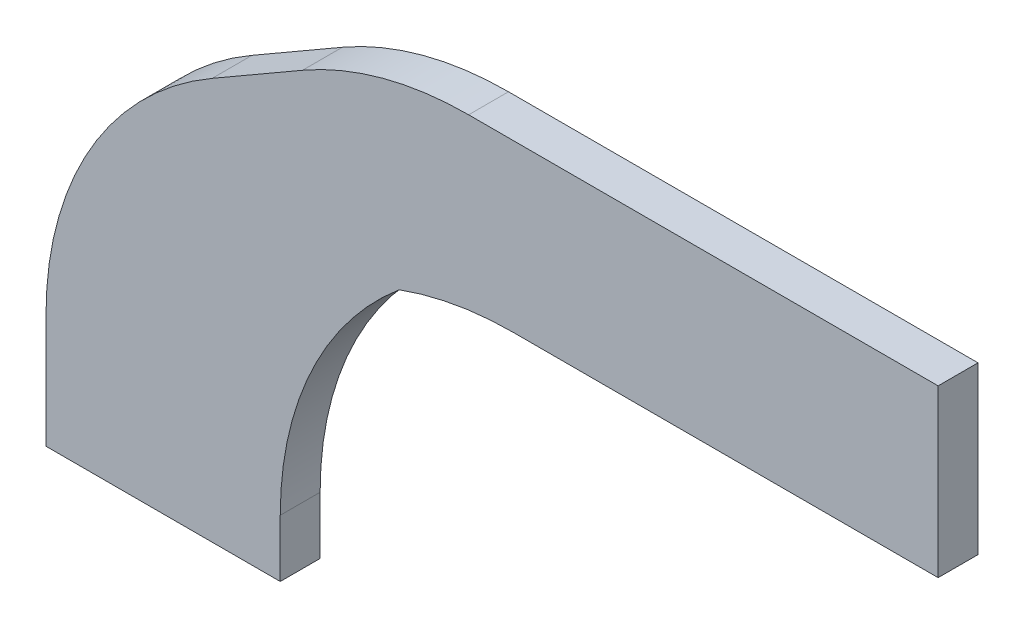
ISO-10303-21;
HEADER;
FILE_DESCRIPTION(('STEP AP214'),'2;1');
FILE_NAME('part.step','',(''),(''),'','','');
FILE_SCHEMA(('AUTOMOTIVE_DESIGN { 1 0 10303 214 1 1 1 1 }'));
ENDSEC;
DATA;
#1=APPLICATION_CONTEXT('core data for automotive mechanical design processes');
#2=APPLICATION_PROTOCOL_DEFINITION('international standard','automotive_design',2000,#1);
#3=PRODUCT_CONTEXT('',#1,'mechanical');
#4=PRODUCT('Part','Part','',(#3));
#5=PRODUCT_RELATED_PRODUCT_CATEGORY('part','',(#4));
#6=PRODUCT_DEFINITION_FORMATION('','',#4);
#7=PRODUCT_DEFINITION_CONTEXT('part definition',#1,'design');
#8=PRODUCT_DEFINITION('design','',#6,#7);
#9=PRODUCT_DEFINITION_SHAPE('','',#8);
#10=(LENGTH_UNIT() NAMED_UNIT(*) SI_UNIT(.MILLI.,.METRE.));
#11=(NAMED_UNIT(*) PLANE_ANGLE_UNIT() SI_UNIT($,.RADIAN.));
#12=(NAMED_UNIT(*) SI_UNIT($,.STERADIAN.) SOLID_ANGLE_UNIT());
#13=UNCERTAINTY_MEASURE_WITH_UNIT(LENGTH_MEASURE(1.E-05),#10,'distance_accuracy_value','');
#14=(GEOMETRIC_REPRESENTATION_CONTEXT(3) GLOBAL_UNCERTAINTY_ASSIGNED_CONTEXT((#13)) GLOBAL_UNIT_ASSIGNED_CONTEXT((#10,
#11,#12)) REPRESENTATION_CONTEXT('',''));
#15=CARTESIAN_POINT('',(0.,0.,0.));
#16=DIRECTION('',(0.,0.,1.));
#17=DIRECTION('',(1.,0.,0.));
#18=AXIS2_PLACEMENT_3D('',#15,#16,#17);
#19=CARTESIAN_POINT('',(2.27602540378444,2.,0.12));
#20=DIRECTION('',(0.,1.,0.));
#21=DIRECTION('',(-1.,0.,0.));
#22=AXIS2_PLACEMENT_3D('',#19,#20,#21);
#23=PLANE('',#22);
#24=DIRECTION('',(1.,0.,0.));
#25=VECTOR('',#24,1.);
#26=CARTESIAN_POINT('',(2.27602540378444,2.,0.12));
#27=LINE('',#26,#25);
#28=CARTESIAN_POINT('',(2.81192378864668,2.,0.12));
#29=VERTEX_POINT('',#28);
#30=CARTESIAN_POINT('',(5.37,2.,0.12));
#31=VERTEX_POINT('',#30);
#32=EDGE_CURVE('E146',#29,#31,#27,.T.);
#33=ORIENTED_EDGE('',*,*,#32,.F.);
#34=DIRECTION('',(0.,0.,-1.));
#35=VECTOR('',#34,1.);
#36=CARTESIAN_POINT('',(2.81192378864668,2.,-0.12));
#37=LINE('',#36,#35);
#38=CARTESIAN_POINT('',(2.81192378864668,2.,-0.12));
#39=VERTEX_POINT('',#38);
#40=EDGE_CURVE('E224',#29,#39,#37,.T.);
#41=ORIENTED_EDGE('',*,*,#40,.T.);
#42=DIRECTION('',(1.,0.,0.));
#43=VECTOR('',#42,1.);
#44=CARTESIAN_POINT('',(2.27602540378444,2.,-0.12));
#45=LINE('',#44,#43);
#46=CARTESIAN_POINT('',(5.37,2.,-0.12));
#47=VERTEX_POINT('',#46);
#48=EDGE_CURVE('E160',#39,#47,#45,.T.);
#49=ORIENTED_EDGE('',*,*,#48,.T.);
#50=DIRECTION('',(0.,0.,-1.));
#51=VECTOR('',#50,1.);
#52=CARTESIAN_POINT('',(5.37,2.,0.12));
#53=LINE('',#52,#51);
#54=EDGE_CURVE('E159',#31,#47,#53,.T.);
#55=ORIENTED_EDGE('',*,*,#54,.F.);
#56=EDGE_LOOP('',(#33,#41,#49,#55));
#57=FACE_BOUND('',#56,.T.);
#58=ADVANCED_FACE('F42',(#57),#23,.F.);
#59=CARTESIAN_POINT('',(5.37,2.,0.12));
#60=DIRECTION('',(-1.,0.,0.));
#61=DIRECTION('',(0.,-1.,0.));
#62=AXIS2_PLACEMENT_3D('',#59,#60,#61);
#63=PLANE('',#62);
#64=DIRECTION('',(0.,1.,0.));
#65=VECTOR('',#64,1.);
#66=CARTESIAN_POINT('',(5.37,2.,-0.12));
#67=LINE('',#66,#65);
#68=CARTESIAN_POINT('',(5.37,3.,-0.12));
#69=VERTEX_POINT('',#68);
#70=EDGE_CURVE('E193',#47,#69,#67,.T.);
#71=ORIENTED_EDGE('',*,*,#70,.T.);
#72=DIRECTION('',(0.,0.,-1.));
#73=VECTOR('',#72,1.);
#74=CARTESIAN_POINT('',(5.37,3.,0.12));
#75=LINE('',#74,#73);
#76=CARTESIAN_POINT('',(5.37,3.,0.12));
#77=VERTEX_POINT('',#76);
#78=EDGE_CURVE('E165',#77,#69,#75,.T.);
#79=ORIENTED_EDGE('',*,*,#78,.F.);
#80=DIRECTION('',(0.,1.,0.));
#81=VECTOR('',#80,1.);
#82=CARTESIAN_POINT('',(5.37,2.,0.12));
#83=LINE('',#82,#81);
#84=EDGE_CURVE('E151',#31,#77,#83,.T.);
#85=ORIENTED_EDGE('',*,*,#84,.F.);
#86=ORIENTED_EDGE('',*,*,#54,.T.);
#87=EDGE_LOOP('',(#71,#79,#85,#86));
#88=FACE_BOUND('',#87,.T.);
#89=ADVANCED_FACE('F167',(#88),#63,.F.);
#90=CARTESIAN_POINT('',(5.37,3.,0.12));
#91=DIRECTION('',(0.,-1.,0.));
#92=DIRECTION('',(1.,0.,0.));
#93=AXIS2_PLACEMENT_3D('',#90,#91,#92);
#94=PLANE('',#93);
#95=DIRECTION('',(-1.,0.,0.));
#96=VECTOR('',#95,1.);
#97=CARTESIAN_POINT('',(5.37,3.,-0.12));
#98=LINE('',#97,#96);
#99=CARTESIAN_POINT('',(2.54397459621556,3.,-0.12));
#100=VERTEX_POINT('',#99);
#101=EDGE_CURVE('E196',#69,#100,#98,.T.);
#102=ORIENTED_EDGE('',*,*,#101,.T.);
#103=DIRECTION('',(0.,0.,-1.));
#104=VECTOR('',#103,1.);
#105=CARTESIAN_POINT('',(2.54397459621556,3.,0.12));
#106=LINE('',#105,#104);
#107=CARTESIAN_POINT('',(2.54397459621556,3.,0.12));
#108=VERTEX_POINT('',#107);
#109=EDGE_CURVE('E240',#100,#108,#106,.F.);
#110=ORIENTED_EDGE('',*,*,#109,.T.);
#111=DIRECTION('',(-1.,0.,0.));
#112=VECTOR('',#111,1.);
#113=CARTESIAN_POINT('',(5.37,3.,0.12));
#114=LINE('',#113,#112);
#115=EDGE_CURVE('E171',#77,#108,#114,.T.);
#116=ORIENTED_EDGE('',*,*,#115,.F.);
#117=ORIENTED_EDGE('',*,*,#78,.T.);
#118=EDGE_LOOP('',(#102,#110,#116,#117));
#119=FACE_BOUND('',#118,.T.);
#120=ADVANCED_FACE('F271',(#119),#94,.F.);
#121=CARTESIAN_POINT('',(2.00807621135331,3.,0.12));
#122=DIRECTION('',(0.500000000000001,-0.866025403784438,0.));
#123=DIRECTION('',(0.866025403784438,0.500000000000001,0.));
#124=AXIS2_PLACEMENT_3D('',#121,#122,#123);
#125=PLANE('',#124);
#126=DIRECTION('',(-0.866025403784438,-0.500000000000001,0.));
#127=VECTOR('',#126,1.);
#128=CARTESIAN_POINT('',(2.00807621135331,3.,0.12));
#129=LINE('',#128,#127);
#130=CARTESIAN_POINT('',(1.54397459621556,2.73205080756888,0.12));
#131=VERTEX_POINT('',#130);
#132=CARTESIAN_POINT('',(0.999999999999999,2.4179869280115,0.12));
#133=VERTEX_POINT('',#132);
#134=EDGE_CURVE('E175',#131,#133,#129,.T.);
#135=ORIENTED_EDGE('',*,*,#134,.F.);
#136=DIRECTION('',(0.,0.,-1.));
#137=VECTOR('',#136,1.);
#138=CARTESIAN_POINT('',(1.54397459621556,2.73205080756888,0.12));
#139=LINE('',#138,#137);
#140=CARTESIAN_POINT('',(1.54397459621556,2.73205080756888,-0.12));
#141=VERTEX_POINT('',#140);
#142=EDGE_CURVE('E230',#131,#141,#139,.T.);
#143=ORIENTED_EDGE('',*,*,#142,.T.);
#144=DIRECTION('',(-0.866025403784438,-0.500000000000001,0.));
#145=VECTOR('',#144,1.);
#146=CARTESIAN_POINT('',(2.00807621135331,3.,-0.12));
#147=LINE('',#146,#145);
#148=CARTESIAN_POINT('',(0.999999999999999,2.4179869280115,-0.12));
#149=VERTEX_POINT('',#148);
#150=EDGE_CURVE('E200',#141,#149,#147,.T.);
#151=ORIENTED_EDGE('',*,*,#150,.T.);
#152=DIRECTION('',(0.,0.,-1.));
#153=VECTOR('',#152,1.);
#154=CARTESIAN_POINT('',(0.999999999999999,2.4179869280115,0.12));
#155=LINE('',#154,#153);
#156=EDGE_CURVE('E227',#149,#133,#155,.F.);
#157=ORIENTED_EDGE('',*,*,#156,.T.);
#158=EDGE_LOOP('',(#135,#143,#151,#157));
#159=FACE_BOUND('',#158,.T.);
#160=ADVANCED_FACE('F279',(#159),#125,.F.);
#161=CARTESIAN_POINT('',(0.,1.84063665882188,0.12));
#162=DIRECTION('',(1.,0.,0.));
#163=DIRECTION('',(0.,1.,0.));
#164=AXIS2_PLACEMENT_3D('',#161,#162,#163);
#165=PLANE('',#164);
#166=DIRECTION('',(0.,-1.,0.));
#167=VECTOR('',#166,1.);
#168=CARTESIAN_POINT('',(0.,1.84063665882188,0.12));
#169=LINE('',#168,#167);
#170=CARTESIAN_POINT('',(0.,0.685936120442628,0.12));
#171=VERTEX_POINT('',#170);
#172=CARTESIAN_POINT('',(0.,0.,0.12));
#173=VERTEX_POINT('',#172);
#174=EDGE_CURVE('E181',#171,#173,#169,.T.);
#175=ORIENTED_EDGE('',*,*,#174,.F.);
#176=DIRECTION('',(0.,0.,-1.));
#177=VECTOR('',#176,1.);
#178=CARTESIAN_POINT('',(0.,0.685936120442628,0.12));
#179=LINE('',#178,#177);
#180=CARTESIAN_POINT('',(0.,0.685936120442628,-0.12));
#181=VERTEX_POINT('',#180);
#182=EDGE_CURVE('E249',#171,#181,#179,.T.);
#183=ORIENTED_EDGE('',*,*,#182,.T.);
#184=DIRECTION('',(0.,-1.,0.));
#185=VECTOR('',#184,1.);
#186=CARTESIAN_POINT('',(0.,1.84063665882188,-0.12));
#187=LINE('',#186,#185);
#188=CARTESIAN_POINT('',(0.,0.,-0.12));
#189=VERTEX_POINT('',#188);
#190=EDGE_CURVE('E204',#181,#189,#187,.T.);
#191=ORIENTED_EDGE('',*,*,#190,.T.);
#192=DIRECTION('',(0.,0.,-1.));
#193=VECTOR('',#192,1.);
#194=CARTESIAN_POINT('',(0.,0.,0.12));
#195=LINE('',#194,#193);
#196=EDGE_CURVE('E216',#173,#189,#195,.T.);
#197=ORIENTED_EDGE('',*,*,#196,.F.);
#198=EDGE_LOOP('',(#175,#183,#191,#197));
#199=FACE_BOUND('',#198,.T.);
#200=ADVANCED_FACE('F288',(#199),#165,.F.);
#201=CARTESIAN_POINT('',(0.,0.,0.12));
#202=DIRECTION('',(0.,1.,0.));
#203=DIRECTION('',(0.,0.,1.));
#204=AXIS2_PLACEMENT_3D('',#201,#202,#203);
#205=PLANE('',#204);
#206=DIRECTION('',(1.,0.,0.));
#207=VECTOR('',#206,1.);
#208=CARTESIAN_POINT('',(0.,0.,-0.12));
#209=LINE('',#208,#207);
#210=CARTESIAN_POINT('',(1.41,0.,-0.12));
#211=VERTEX_POINT('',#210);
#212=EDGE_CURVE('E207',#189,#211,#209,.T.);
#213=ORIENTED_EDGE('',*,*,#212,.T.);
#214=DIRECTION('',(0.,0.,-1.));
#215=VECTOR('',#214,1.);
#216=CARTESIAN_POINT('',(1.41,0.,0.12));
#217=LINE('',#216,#215);
#218=CARTESIAN_POINT('',(1.41,0.,0.12));
#219=VERTEX_POINT('',#218);
#220=EDGE_CURVE('E190',#219,#211,#217,.T.);
#221=ORIENTED_EDGE('',*,*,#220,.F.);
#222=DIRECTION('',(1.,0.,0.));
#223=VECTOR('',#222,1.);
#224=CARTESIAN_POINT('',(0.,0.,0.12));
#225=LINE('',#224,#223);
#226=EDGE_CURVE('E184',#173,#219,#225,.T.);
#227=ORIENTED_EDGE('',*,*,#226,.F.);
#228=ORIENTED_EDGE('',*,*,#196,.T.);
#229=EDGE_LOOP('',(#213,#221,#227,#228));
#230=FACE_BOUND('',#229,.T.);
#231=ADVANCED_FACE('F294',(#230),#205,.F.);
#232=CARTESIAN_POINT('',(1.41,0.,0.12));
#233=DIRECTION('',(-1.,0.,0.));
#234=DIRECTION('',(0.,-1.,0.));
#235=AXIS2_PLACEMENT_3D('',#232,#233,#234);
#236=PLANE('',#235);
#237=DIRECTION('',(0.,1.,0.));
#238=VECTOR('',#237,1.);
#239=CARTESIAN_POINT('',(1.41,0.,-0.12));
#240=LINE('',#239,#238);
#241=CARTESIAN_POINT('',(1.41,0.345299461620748,-0.12));
#242=VERTEX_POINT('',#241);
#243=EDGE_CURVE('E156',#211,#242,#240,.T.);
#244=ORIENTED_EDGE('',*,*,#243,.T.);
#245=DIRECTION('',(0.,0.,-1.));
#246=VECTOR('',#245,1.);
#247=CARTESIAN_POINT('',(1.41,0.345299461620748,0.12));
#248=LINE('',#247,#246);
#249=CARTESIAN_POINT('',(1.41,0.345299461620748,0.12));
#250=VERTEX_POINT('',#249);
#251=EDGE_CURVE('E164',#242,#250,#248,.F.);
#252=ORIENTED_EDGE('',*,*,#251,.T.);
#253=DIRECTION('',(0.,1.,0.));
#254=VECTOR('',#253,1.);
#255=CARTESIAN_POINT('',(1.41,0.,0.12));
#256=LINE('',#255,#254);
#257=EDGE_CURVE('E187',#219,#250,#256,.T.);
#258=ORIENTED_EDGE('',*,*,#257,.F.);
#259=ORIENTED_EDGE('',*,*,#220,.T.);
#260=EDGE_LOOP('',(#244,#252,#258,#259));
#261=FACE_BOUND('',#260,.T.);
#262=ADVANCED_FACE('F297',(#261),#236,.F.);
#263=CARTESIAN_POINT('',(0.,0.,0.12));
#264=DIRECTION('',(0.,0.,1.));
#265=DIRECTION('',(1.,0.,0.));
#266=AXIS2_PLACEMENT_3D('',#263,#264,#265);
#267=PLANE('',#266);
#268=ORIENTED_EDGE('',*,*,#115,.T.);
#269=CARTESIAN_POINT('',(2.54397459621556,1.,0.12));
#270=DIRECTION('',(0.,0.,1.));
#271=DIRECTION('',(1.,0.,0.));
#272=AXIS2_PLACEMENT_3D('',#269,#270,#271);
#273=CIRCLE('',#272,2.);
#274=EDGE_CURVE('E246',#108,#131,#273,.T.);
#275=ORIENTED_EDGE('',*,*,#274,.T.);
#276=ORIENTED_EDGE('',*,*,#134,.T.);
#277=CARTESIAN_POINT('',(2.,0.685936120442628,0.12));
#278=DIRECTION('',(0.,0.,1.));
#279=DIRECTION('',(1.,0.,0.));
#280=AXIS2_PLACEMENT_3D('',#277,#278,#279);
#281=CIRCLE('',#280,2.);
#282=EDGE_CURVE('E243',#133,#171,#281,.T.);
#283=ORIENTED_EDGE('',*,*,#282,.T.);
#284=ORIENTED_EDGE('',*,*,#174,.T.);
#285=ORIENTED_EDGE('',*,*,#226,.T.);
#286=ORIENTED_EDGE('',*,*,#257,.T.);
#287=CARTESIAN_POINT('',(3.41,0.345299461620749,0.12));
#288=DIRECTION('',(0.,0.,1.));
#289=DIRECTION('',(1.,0.,0.));
#290=AXIS2_PLACEMENT_3D('',#287,#288,#289);
#291=CIRCLE('',#290,2.);
#292=CARTESIAN_POINT('',(2.12597860997223,1.87869082391256,0.12));
#293=VERTEX_POINT('',#292);
#294=EDGE_CURVE('E61',#250,#293,#291,.F.);
#295=ORIENTED_EDGE('',*,*,#294,.T.);
#296=CARTESIAN_POINT('',(2.81192378864668,0.,0.12));
#297=DIRECTION('',(0.,0.,1.));
#298=DIRECTION('',(1.,0.,0.));
#299=AXIS2_PLACEMENT_3D('',#296,#297,#298);
#300=CIRCLE('',#299,2.);
#301=EDGE_CURVE('E11',#293,#29,#300,.F.);
#302=ORIENTED_EDGE('',*,*,#301,.T.);
#303=ORIENTED_EDGE('',*,*,#32,.T.);
#304=ORIENTED_EDGE('',*,*,#84,.T.);
#305=EDGE_LOOP('',(#268,#275,#276,#283,#284,#285,#286,#295,#302,#303,#304));
#306=FACE_BOUND('',#305,.T.);
#307=ADVANCED_FACE('F149',(#306),#267,.T.);
#308=CARTESIAN_POINT('',(0.,0.,-0.12));
#309=DIRECTION('',(0.,0.,1.));
#310=DIRECTION('',(1.,0.,0.));
#311=AXIS2_PLACEMENT_3D('',#308,#309,#310);
#312=PLANE('',#311);
#313=ORIENTED_EDGE('',*,*,#150,.F.);
#314=CARTESIAN_POINT('',(2.54397459621556,1.,-0.12));
#315=DIRECTION('',(0.,0.,1.));
#316=DIRECTION('',(1.,0.,0.));
#317=AXIS2_PLACEMENT_3D('',#314,#315,#316);
#318=CIRCLE('',#317,2.);
#319=EDGE_CURVE('E237',#141,#100,#318,.F.);
#320=ORIENTED_EDGE('',*,*,#319,.T.);
#321=ORIENTED_EDGE('',*,*,#101,.F.);
#322=ORIENTED_EDGE('',*,*,#70,.F.);
#323=ORIENTED_EDGE('',*,*,#48,.F.);
#324=CARTESIAN_POINT('',(2.81192378864668,0.,-0.12));
#325=DIRECTION('',(0.,0.,1.));
#326=DIRECTION('',(1.,0.,0.));
#327=AXIS2_PLACEMENT_3D('',#324,#325,#326);
#328=CIRCLE('',#327,2.);
#329=CARTESIAN_POINT('',(2.12597860997223,1.87869082391256,-0.12));
#330=VERTEX_POINT('',#329);
#331=EDGE_CURVE('E52',#39,#330,#328,.T.);
#332=ORIENTED_EDGE('',*,*,#331,.T.);
#333=CARTESIAN_POINT('',(3.41,0.345299461620749,-0.12));
#334=DIRECTION('',(0.,0.,1.));
#335=DIRECTION('',(1.,0.,0.));
#336=AXIS2_PLACEMENT_3D('',#333,#334,#335);
#337=CIRCLE('',#336,2.);
#338=EDGE_CURVE('E253',#330,#242,#337,.T.);
#339=ORIENTED_EDGE('',*,*,#338,.T.);
#340=ORIENTED_EDGE('',*,*,#243,.F.);
#341=ORIENTED_EDGE('',*,*,#212,.F.);
#342=ORIENTED_EDGE('',*,*,#190,.F.);
#343=CARTESIAN_POINT('',(2.,0.685936120442628,-0.12));
#344=DIRECTION('',(0.,0.,1.));
#345=DIRECTION('',(1.,0.,0.));
#346=AXIS2_PLACEMENT_3D('',#343,#344,#345);
#347=CIRCLE('',#346,2.);
#348=EDGE_CURVE('E234',#181,#149,#347,.F.);
#349=ORIENTED_EDGE('',*,*,#348,.T.);
#350=EDGE_LOOP('',(#313,#320,#321,#322,#323,#332,#339,#340,#341,#342,#349));
#351=FACE_BOUND('',#350,.T.);
#352=ADVANCED_FACE('F268',(#351),#312,.F.);
#353=CARTESIAN_POINT('',(2.81192378864668,0.,0.12));
#354=DIRECTION('',(0.,0.,1.));
#355=DIRECTION('',(1.,0.,0.));
#356=AXIS2_PLACEMENT_3D('',#353,#354,#355);
#357=CYLINDRICAL_SURFACE('',#356,2.);
#358=ORIENTED_EDGE('',*,*,#40,.F.);
#359=ORIENTED_EDGE('',*,*,#301,.F.);
#360=DIRECTION('',(0.,0.,1.));
#361=VECTOR('',#360,1.);
#362=CARTESIAN_POINT('',(2.12597860997223,1.87869082391256,0.));
#363=LINE('',#362,#361);
#364=EDGE_CURVE('E46',#330,#293,#363,.T.);
#365=ORIENTED_EDGE('',*,*,#364,.F.);
#366=ORIENTED_EDGE('',*,*,#331,.F.);
#367=EDGE_LOOP('',(#358,#359,#365,#366));
#368=FACE_BOUND('',#367,.T.);
#369=ADVANCED_FACE('F266',(#368),#357,.F.);
#370=CARTESIAN_POINT('',(3.41,0.345299461620749,0.12));
#371=DIRECTION('',(0.,0.,1.));
#372=DIRECTION('',(1.,0.,0.));
#373=AXIS2_PLACEMENT_3D('',#370,#371,#372);
#374=CYLINDRICAL_SURFACE('',#373,2.);
#375=ORIENTED_EDGE('',*,*,#294,.F.);
#376=ORIENTED_EDGE('',*,*,#251,.F.);
#377=ORIENTED_EDGE('',*,*,#338,.F.);
#378=ORIENTED_EDGE('',*,*,#364,.T.);
#379=EDGE_LOOP('',(#375,#376,#377,#378));
#380=FACE_BOUND('',#379,.T.);
#381=ADVANCED_FACE('F263',(#380),#374,.F.);
#382=CARTESIAN_POINT('',(2.54397459621556,1.,0.12));
#383=DIRECTION('',(0.,0.,-1.));
#384=DIRECTION('',(-1.,0.,0.));
#385=AXIS2_PLACEMENT_3D('',#382,#383,#384);
#386=CYLINDRICAL_SURFACE('',#385,2.);
#387=ORIENTED_EDGE('',*,*,#274,.F.);
#388=ORIENTED_EDGE('',*,*,#109,.F.);
#389=ORIENTED_EDGE('',*,*,#319,.F.);
#390=ORIENTED_EDGE('',*,*,#142,.F.);
#391=EDGE_LOOP('',(#387,#388,#389,#390));
#392=FACE_BOUND('',#391,.T.);
#393=ADVANCED_FACE('F277',(#392),#386,.T.);
#394=CARTESIAN_POINT('',(2.,0.685936120442628,0.12));
#395=DIRECTION('',(0.,0.,-1.));
#396=DIRECTION('',(-1.,0.,0.));
#397=AXIS2_PLACEMENT_3D('',#394,#395,#396);
#398=CYLINDRICAL_SURFACE('',#397,2.);
#399=ORIENTED_EDGE('',*,*,#282,.F.);
#400=ORIENTED_EDGE('',*,*,#156,.F.);
#401=ORIENTED_EDGE('',*,*,#348,.F.);
#402=ORIENTED_EDGE('',*,*,#182,.F.);
#403=EDGE_LOOP('',(#399,#400,#401,#402));
#404=FACE_BOUND('',#403,.T.);
#405=ADVANCED_FACE('F44',(#404),#398,.T.);
#406=CLOSED_SHELL('',(#58,#89,#120,#160,#200,#231,#262,#307,#352,#369,#381,#393,#405));
#407=MANIFOLD_SOLID_BREP('B2',#406);
#408=ADVANCED_BREP_SHAPE_REPRESENTATION('',(#18,#407),#14);
#409=SHAPE_DEFINITION_REPRESENTATION(#9,#408);
ENDSEC;
END-ISO-10303-21;
